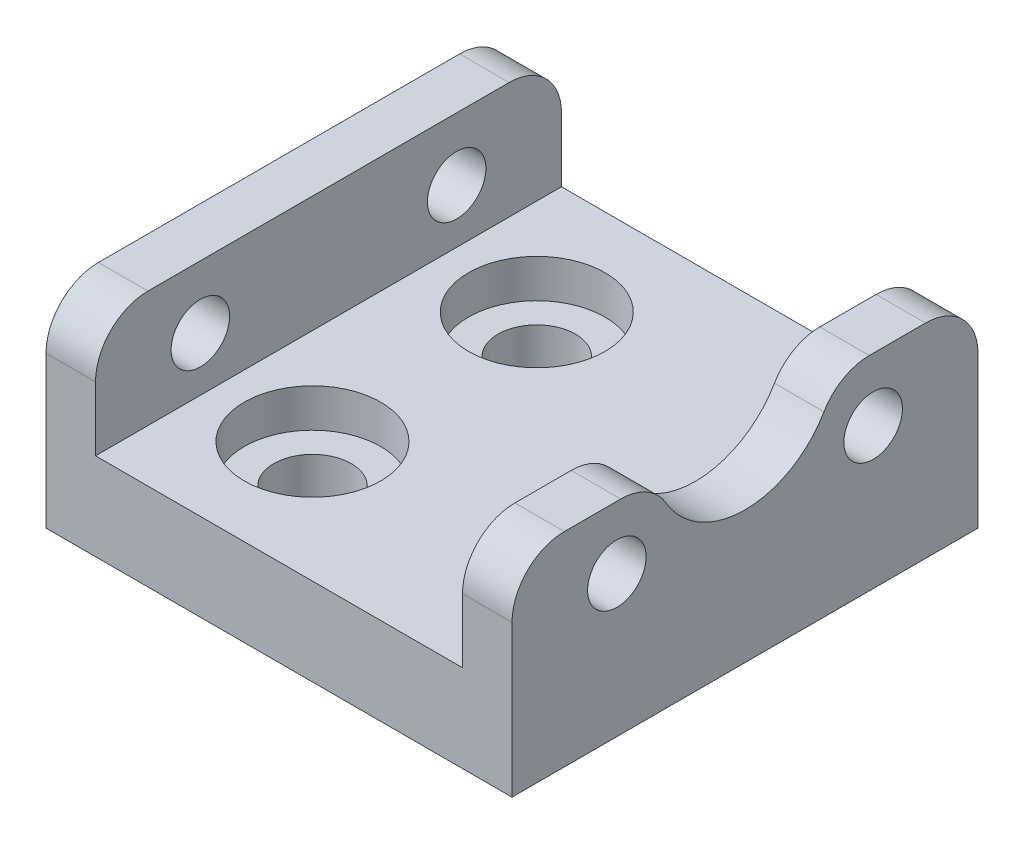
ISO-10303-21;
HEADER;
FILE_DESCRIPTION(('STEP AP214'),'2;1');
FILE_NAME('part.step','',(''),(''),'','','');
FILE_SCHEMA(('AUTOMOTIVE_DESIGN { 1 0 10303 214 1 1 1 1 }'));
ENDSEC;
DATA;
#1=APPLICATION_CONTEXT('core data for automotive mechanical design processes');
#2=APPLICATION_PROTOCOL_DEFINITION('international standard','automotive_design',2000,#1);
#3=PRODUCT_CONTEXT('',#1,'mechanical');
#4=PRODUCT('Part','Part','',(#3));
#5=PRODUCT_RELATED_PRODUCT_CATEGORY('part','',(#4));
#6=PRODUCT_DEFINITION_FORMATION('','',#4);
#7=PRODUCT_DEFINITION_CONTEXT('part definition',#1,'design');
#8=PRODUCT_DEFINITION('design','',#6,#7);
#9=PRODUCT_DEFINITION_SHAPE('','',#8);
#10=(LENGTH_UNIT() NAMED_UNIT(*) SI_UNIT(.MILLI.,.METRE.));
#11=(NAMED_UNIT(*) PLANE_ANGLE_UNIT() SI_UNIT($,.RADIAN.));
#12=(NAMED_UNIT(*) SI_UNIT($,.STERADIAN.) SOLID_ANGLE_UNIT());
#13=UNCERTAINTY_MEASURE_WITH_UNIT(LENGTH_MEASURE(1.E-05),#10,'distance_accuracy_value','');
#14=(GEOMETRIC_REPRESENTATION_CONTEXT(3) GLOBAL_UNCERTAINTY_ASSIGNED_CONTEXT((#13)) GLOBAL_UNIT_ASSIGNED_CONTEXT((#10,
#11,#12)) REPRESENTATION_CONTEXT('',''));
#15=CARTESIAN_POINT('',(0.,0.,0.));
#16=DIRECTION('',(0.,0.,1.));
#17=DIRECTION('',(1.,0.,0.));
#18=AXIS2_PLACEMENT_3D('',#15,#16,#17);
#19=CARTESIAN_POINT('',(0.,17.78,0.));
#20=DIRECTION('',(0.,1.,0.));
#21=DIRECTION('',(0.,0.,1.));
#22=AXIS2_PLACEMENT_3D('',#19,#20,#21);
#23=PLANE('',#22);
#24=DIRECTION('',(0.,0.,-1.));
#25=VECTOR('',#24,1.);
#26=CARTESIAN_POINT('',(40.64,17.78,0.));
#27=LINE('',#26,#25);
#28=CARTESIAN_POINT('',(40.64,17.78,36.068));
#29=VERTEX_POINT('',#28);
#30=CARTESIAN_POINT('',(40.64,17.78,31.1615412763114));
#31=VERTEX_POINT('',#30);
#32=EDGE_CURVE('E159',#29,#31,#27,.T.);
#33=ORIENTED_EDGE('',*,*,#32,.T.);
#34=DIRECTION('',(-1.,0.,0.));
#35=VECTOR('',#34,1.);
#36=CARTESIAN_POINT('',(36.322,17.78,31.1615412763114));
#37=LINE('',#36,#35);
#38=CARTESIAN_POINT('',(36.322,17.78,31.1615412763114));
#39=VERTEX_POINT('',#38);
#40=EDGE_CURVE('E223',#31,#39,#37,.T.);
#41=ORIENTED_EDGE('',*,*,#40,.T.);
#42=DIRECTION('',(0.,0.,1.));
#43=VECTOR('',#42,1.);
#44=CARTESIAN_POINT('',(36.322,17.78,0.));
#45=LINE('',#44,#43);
#46=CARTESIAN_POINT('',(36.322,17.78,36.068));
#47=VERTEX_POINT('',#46);
#48=EDGE_CURVE('E174',#39,#47,#45,.T.);
#49=ORIENTED_EDGE('',*,*,#48,.T.);
#50=DIRECTION('',(1.,0.,0.));
#51=VECTOR('',#50,1.);
#52=CARTESIAN_POINT('',(40.64,17.78,36.068));
#53=LINE('',#52,#51);
#54=EDGE_CURVE('E217',#47,#29,#53,.T.);
#55=ORIENTED_EDGE('',*,*,#54,.T.);
#56=EDGE_LOOP('',(#33,#41,#49,#55));
#57=FACE_BOUND('',#56,.T.);
#58=ADVANCED_FACE('F34',(#57),#23,.T.);
#59=CARTESIAN_POINT('',(0.,7.62,0.));
#60=DIRECTION('',(0.,1.,0.));
#61=DIRECTION('',(0.,0.,1.));
#62=AXIS2_PLACEMENT_3D('',#59,#60,#61);
#63=PLANE('',#62);
#64=CARTESIAN_POINT('',(12.7,7.62,10.541));
#65=DIRECTION('',(0.,1.,0.));
#66=DIRECTION('',(0.,0.,1.));
#67=AXIS2_PLACEMENT_3D('',#64,#65,#66);
#68=CIRCLE('',#67,5.95376);
#69=CARTESIAN_POINT('',(12.7,7.62,16.49476));
#70=VERTEX_POINT('',#69);
#71=EDGE_CURVE('E314',#70,#70,#68,.T.);
#72=ORIENTED_EDGE('',*,*,#71,.F.);
#73=EDGE_LOOP('',(#72));
#74=FACE_BOUND('',#73,.T.);
#75=CARTESIAN_POINT('',(12.7,7.62,30.099));
#76=DIRECTION('',(0.,1.,0.));
#77=DIRECTION('',(0.,0.,1.));
#78=AXIS2_PLACEMENT_3D('',#75,#76,#77);
#79=CIRCLE('',#78,5.95376);
#80=CARTESIAN_POINT('',(12.7,7.62,36.05276));
#81=VERTEX_POINT('',#80);
#82=EDGE_CURVE('E330',#81,#81,#79,.T.);
#83=ORIENTED_EDGE('',*,*,#82,.F.);
#84=EDGE_LOOP('',(#83));
#85=FACE_BOUND('',#84,.T.);
#86=DIRECTION('',(1.,0.,0.));
#87=VECTOR('',#86,1.);
#88=CARTESIAN_POINT('',(0.,7.62,40.64));
#89=LINE('',#88,#87);
#90=CARTESIAN_POINT('',(4.31800000000001,7.62,40.64));
#91=VERTEX_POINT('',#90);
#92=CARTESIAN_POINT('',(36.322,7.62,40.64));
#93=VERTEX_POINT('',#92);
#94=EDGE_CURVE('E169',#91,#93,#89,.T.);
#95=ORIENTED_EDGE('',*,*,#94,.T.);
#96=DIRECTION('',(0.,0.,1.));
#97=VECTOR('',#96,1.);
#98=CARTESIAN_POINT('',(36.322,7.62,0.));
#99=LINE('',#98,#97);
#100=CARTESIAN_POINT('',(36.322,7.62,0.));
#101=VERTEX_POINT('',#100);
#102=EDGE_CURVE('E153',#101,#93,#99,.T.);
#103=ORIENTED_EDGE('',*,*,#102,.F.);
#104=DIRECTION('',(-1.,0.,0.));
#105=VECTOR('',#104,1.);
#106=CARTESIAN_POINT('',(0.,7.62,0.));
#107=LINE('',#106,#105);
#108=CARTESIAN_POINT('',(4.31800000000001,7.62,0.));
#109=VERTEX_POINT('',#108);
#110=EDGE_CURVE('E162',#101,#109,#107,.T.);
#111=ORIENTED_EDGE('',*,*,#110,.T.);
#112=DIRECTION('',(0.,0.,-1.));
#113=VECTOR('',#112,1.);
#114=CARTESIAN_POINT('',(4.31800000000001,7.62,0.));
#115=LINE('',#114,#113);
#116=EDGE_CURVE('E187',#91,#109,#115,.T.);
#117=ORIENTED_EDGE('',*,*,#116,.F.);
#118=EDGE_LOOP('',(#95,#103,#111,#117));
#119=FACE_BOUND('',#118,.T.);
#120=ADVANCED_FACE('F172',(#74,#85,#119),#63,.T.);
#121=CARTESIAN_POINT('',(0.,7.62,0.));
#122=DIRECTION('',(1.,0.,0.));
#123=DIRECTION('',(0.,0.,-1.));
#124=AXIS2_PLACEMENT_3D('',#121,#122,#123);
#125=PLANE('',#124);
#126=CARTESIAN_POINT('',(0.,12.3189999999999,9.14399999999984));
#127=DIRECTION('',(-1.,0.,0.));
#128=DIRECTION('',(0.,0.,1.));
#129=AXIS2_PLACEMENT_3D('',#126,#127,#128);
#130=CIRCLE('',#129,2.5527);
#131=CARTESIAN_POINT('',(0.,12.3189999999999,11.6966999999998));
#132=VERTEX_POINT('',#131);
#133=EDGE_CURVE('E342',#132,#132,#130,.T.);
#134=ORIENTED_EDGE('',*,*,#133,.F.);
#135=EDGE_LOOP('',(#134));
#136=FACE_BOUND('',#135,.T.);
#137=CARTESIAN_POINT('',(0.,12.319,31.496));
#138=DIRECTION('',(-1.,0.,0.));
#139=DIRECTION('',(0.,0.,1.));
#140=AXIS2_PLACEMENT_3D('',#137,#138,#139);
#141=CIRCLE('',#140,2.5527);
#142=CARTESIAN_POINT('',(0.,12.319,34.0487));
#143=VERTEX_POINT('',#142);
#144=EDGE_CURVE('E354',#143,#143,#141,.T.);
#145=ORIENTED_EDGE('',*,*,#144,.F.);
#146=EDGE_LOOP('',(#145));
#147=FACE_BOUND('',#146,.T.);
#148=DIRECTION('',(0.,0.,1.));
#149=VECTOR('',#148,1.);
#150=CARTESIAN_POINT('',(0.,17.78,0.));
#151=LINE('',#150,#149);
#152=CARTESIAN_POINT('',(0.,17.78,4.572));
#153=VERTEX_POINT('',#152);
#154=CARTESIAN_POINT('',(0.,17.78,36.068));
#155=VERTEX_POINT('',#154);
#156=EDGE_CURVE('E188',#153,#155,#151,.T.);
#157=ORIENTED_EDGE('',*,*,#156,.F.);
#158=CARTESIAN_POINT('',(0.,13.208,4.572));
#159=DIRECTION('',(1.,0.,0.));
#160=DIRECTION('',(0.,0.,-1.));
#161=AXIS2_PLACEMENT_3D('',#158,#159,#160);
#162=CIRCLE('',#161,4.572);
#163=CARTESIAN_POINT('',(0.,13.208,0.));
#164=VERTEX_POINT('',#163);
#165=EDGE_CURVE('E266',#153,#164,#162,.F.);
#166=ORIENTED_EDGE('',*,*,#165,.T.);
#167=DIRECTION('',(0.,-1.,0.));
#168=VECTOR('',#167,1.);
#169=CARTESIAN_POINT('',(0.,7.62,0.));
#170=LINE('',#169,#168);
#171=CARTESIAN_POINT('',(0.,0.,0.));
#172=VERTEX_POINT('',#171);
#173=EDGE_CURVE('E168',#164,#172,#170,.T.);
#174=ORIENTED_EDGE('',*,*,#173,.T.);
#175=DIRECTION('',(0.,0.,1.));
#176=VECTOR('',#175,1.);
#177=CARTESIAN_POINT('',(0.,0.,0.));
#178=LINE('',#177,#176);
#179=CARTESIAN_POINT('',(0.,0.,40.64));
#180=VERTEX_POINT('',#179);
#181=EDGE_CURVE('E197',#172,#180,#178,.T.);
#182=ORIENTED_EDGE('',*,*,#181,.T.);
#183=DIRECTION('',(0.,-1.,0.));
#184=VECTOR('',#183,1.);
#185=CARTESIAN_POINT('',(0.,7.62,40.64));
#186=LINE('',#185,#184);
#187=CARTESIAN_POINT('',(0.,13.208,40.64));
#188=VERTEX_POINT('',#187);
#189=EDGE_CURVE('E215',#188,#180,#186,.T.);
#190=ORIENTED_EDGE('',*,*,#189,.F.);
#191=CARTESIAN_POINT('',(0.,13.208,36.068));
#192=DIRECTION('',(1.,0.,0.));
#193=DIRECTION('',(0.,0.,-1.));
#194=AXIS2_PLACEMENT_3D('',#191,#192,#193);
#195=CIRCLE('',#194,4.572);
#196=EDGE_CURVE('E264',#188,#155,#195,.F.);
#197=ORIENTED_EDGE('',*,*,#196,.T.);
#198=EDGE_LOOP('',(#157,#166,#174,#182,#190,#197));
#199=FACE_BOUND('',#198,.T.);
#200=ADVANCED_FACE('F276',(#136,#147,#199),#125,.F.);
#201=CARTESIAN_POINT('',(0.,7.62,40.64));
#202=DIRECTION('',(0.,0.,-1.));
#203=DIRECTION('',(-1.,0.,0.));
#204=AXIS2_PLACEMENT_3D('',#201,#202,#203);
#205=PLANE('',#204);
#206=DIRECTION('',(0.,-1.,0.));
#207=VECTOR('',#206,1.);
#208=CARTESIAN_POINT('',(40.64,7.62,40.64));
#209=LINE('',#208,#207);
#210=CARTESIAN_POINT('',(40.64,13.208,40.64));
#211=VERTEX_POINT('',#210);
#212=CARTESIAN_POINT('',(40.64,0.,40.64));
#213=VERTEX_POINT('',#212);
#214=EDGE_CURVE('E213',#211,#213,#209,.T.);
#215=ORIENTED_EDGE('',*,*,#214,.F.);
#216=DIRECTION('',(1.,0.,0.));
#217=VECTOR('',#216,1.);
#218=CARTESIAN_POINT('',(36.322,13.208,40.64));
#219=LINE('',#218,#217);
#220=CARTESIAN_POINT('',(36.322,13.208,40.64));
#221=VERTEX_POINT('',#220);
#222=EDGE_CURVE('E257',#211,#221,#219,.F.);
#223=ORIENTED_EDGE('',*,*,#222,.T.);
#224=DIRECTION('',(0.,-1.,0.));
#225=VECTOR('',#224,1.);
#226=CARTESIAN_POINT('',(36.322,17.78,40.64));
#227=LINE('',#226,#225);
#228=EDGE_CURVE('E158',#221,#93,#227,.T.);
#229=ORIENTED_EDGE('',*,*,#228,.T.);
#230=ORIENTED_EDGE('',*,*,#94,.F.);
#231=DIRECTION('',(0.,-1.,0.));
#232=VECTOR('',#231,1.);
#233=CARTESIAN_POINT('',(4.31800000000001,17.78,40.64));
#234=LINE('',#233,#232);
#235=CARTESIAN_POINT('',(4.31800000000001,13.208,40.64));
#236=VERTEX_POINT('',#235);
#237=EDGE_CURVE('E195',#236,#91,#234,.T.);
#238=ORIENTED_EDGE('',*,*,#237,.F.);
#239=DIRECTION('',(1.,0.,0.));
#240=VECTOR('',#239,1.);
#241=CARTESIAN_POINT('',(0.,13.208,40.64));
#242=LINE('',#241,#240);
#243=EDGE_CURVE('E255',#236,#188,#242,.F.);
#244=ORIENTED_EDGE('',*,*,#243,.T.);
#245=ORIENTED_EDGE('',*,*,#189,.T.);
#246=DIRECTION('',(1.,0.,0.));
#247=VECTOR('',#246,1.);
#248=CARTESIAN_POINT('',(0.,0.,40.64));
#249=LINE('',#248,#247);
#250=EDGE_CURVE('E202',#180,#213,#249,.T.);
#251=ORIENTED_EDGE('',*,*,#250,.T.);
#252=EDGE_LOOP('',(#215,#223,#229,#230,#238,#244,#245,#251));
#253=FACE_BOUND('',#252,.T.);
#254=ADVANCED_FACE('F271',(#253),#205,.F.);
#255=CARTESIAN_POINT('',(40.64,7.62,0.));
#256=DIRECTION('',(-1.,0.,0.));
#257=DIRECTION('',(0.,0.,1.));
#258=AXIS2_PLACEMENT_3D('',#255,#256,#257);
#259=PLANE('',#258);
#260=CARTESIAN_POINT('',(40.64,12.3189999999999,9.14399999999983));
#261=DIRECTION('',(-1.,0.,0.));
#262=DIRECTION('',(0.,0.,1.));
#263=AXIS2_PLACEMENT_3D('',#260,#261,#262);
#264=CIRCLE('',#263,2.55269999999999);
#265=CARTESIAN_POINT('',(40.64,12.3189999999999,11.6966999999998));
#266=VERTEX_POINT('',#265);
#267=EDGE_CURVE('E345',#266,#266,#264,.T.);
#268=ORIENTED_EDGE('',*,*,#267,.T.);
#269=EDGE_LOOP('',(#268));
#270=FACE_BOUND('',#269,.T.);
#271=CARTESIAN_POINT('',(40.64,12.319,31.496));
#272=DIRECTION('',(-1.,0.,0.));
#273=DIRECTION('',(0.,0.,1.));
#274=AXIS2_PLACEMENT_3D('',#271,#272,#273);
#275=CIRCLE('',#274,2.55269999999999);
#276=CARTESIAN_POINT('',(40.64,12.319,34.0487));
#277=VERTEX_POINT('',#276);
#278=EDGE_CURVE('E220',#277,#277,#275,.T.);
#279=ORIENTED_EDGE('',*,*,#278,.T.);
#280=EDGE_LOOP('',(#279));
#281=FACE_BOUND('',#280,.T.);
#282=CARTESIAN_POINT('',(40.64,19.5045530119415,20.32));
#283=DIRECTION('',(1.,0.,0.));
#284=DIRECTION('',(0.,0.,-1.));
#285=AXIS2_PLACEMENT_3D('',#282,#283,#284);
#286=CIRCLE('',#285,7.96536802834442);
#287=CARTESIAN_POINT('',(40.64,15.5041629829732,27.207958147601));
#288=VERTEX_POINT('',#287);
#289=CARTESIAN_POINT('',(40.64,15.5041629829732,13.432041852399));
#290=VERTEX_POINT('',#289);
#291=EDGE_CURVE('E315',#288,#290,#286,.T.);
#292=ORIENTED_EDGE('',*,*,#291,.F.);
#293=CARTESIAN_POINT('',(40.64,13.208,31.1615412763114));
#294=DIRECTION('',(-1.,0.,0.));
#295=DIRECTION('',(0.,0.,1.));
#296=AXIS2_PLACEMENT_3D('',#293,#294,#295);
#297=CIRCLE('',#296,4.572);
#298=EDGE_CURVE('E243',#288,#31,#297,.F.);
#299=ORIENTED_EDGE('',*,*,#298,.T.);
#300=ORIENTED_EDGE('',*,*,#32,.F.);
#301=CARTESIAN_POINT('',(40.64,13.208,36.068));
#302=DIRECTION('',(-1.,0.,0.));
#303=DIRECTION('',(0.,0.,1.));
#304=AXIS2_PLACEMENT_3D('',#301,#302,#303);
#305=CIRCLE('',#304,4.572);
#306=EDGE_CURVE('E237',#29,#211,#305,.F.);
#307=ORIENTED_EDGE('',*,*,#306,.T.);
#308=ORIENTED_EDGE('',*,*,#214,.T.);
#309=DIRECTION('',(0.,0.,-1.));
#310=VECTOR('',#309,1.);
#311=CARTESIAN_POINT('',(40.64,0.,0.));
#312=LINE('',#311,#310);
#313=CARTESIAN_POINT('',(40.64,0.,0.));
#314=VERTEX_POINT('',#313);
#315=EDGE_CURVE('E205',#213,#314,#312,.T.);
#316=ORIENTED_EDGE('',*,*,#315,.T.);
#317=DIRECTION('',(0.,-1.,0.));
#318=VECTOR('',#317,1.);
#319=CARTESIAN_POINT('',(40.64,7.62,0.));
#320=LINE('',#319,#318);
#321=CARTESIAN_POINT('',(40.64,13.208,0.));
#322=VERTEX_POINT('',#321);
#323=EDGE_CURVE('E211',#322,#314,#320,.T.);
#324=ORIENTED_EDGE('',*,*,#323,.F.);
#325=CARTESIAN_POINT('',(40.64,13.208,4.572));
#326=DIRECTION('',(-1.,0.,0.));
#327=DIRECTION('',(0.,0.,1.));
#328=AXIS2_PLACEMENT_3D('',#325,#326,#327);
#329=CIRCLE('',#328,4.572);
#330=CARTESIAN_POINT('',(40.64,17.78,4.572));
#331=VERTEX_POINT('',#330);
#332=EDGE_CURVE('E239',#322,#331,#329,.F.);
#333=ORIENTED_EDGE('',*,*,#332,.T.);
#334=CARTESIAN_POINT('',(40.64,17.78,9.47845872368865));
#335=VERTEX_POINT('',#334);
#336=EDGE_CURVE('E184',#335,#331,#27,.T.);
#337=ORIENTED_EDGE('',*,*,#336,.F.);
#338=CARTESIAN_POINT('',(40.64,13.208,9.47845872368865));
#339=DIRECTION('',(-1.,0.,0.));
#340=DIRECTION('',(0.,0.,1.));
#341=AXIS2_PLACEMENT_3D('',#338,#339,#340);
#342=CIRCLE('',#341,4.572);
#343=EDGE_CURVE('E241',#335,#290,#342,.F.);
#344=ORIENTED_EDGE('',*,*,#343,.T.);
#345=EDGE_LOOP('',(#292,#299,#300,#307,#308,#316,#324,#333,#337,#344));
#346=FACE_BOUND('',#345,.T.);
#347=ADVANCED_FACE('F368',(#270,#281,#346),#259,.F.);
#348=CARTESIAN_POINT('',(0.,7.62,0.));
#349=DIRECTION('',(0.,0.,1.));
#350=DIRECTION('',(1.,0.,0.));
#351=AXIS2_PLACEMENT_3D('',#348,#349,#350);
#352=PLANE('',#351);
#353=DIRECTION('',(0.,-1.,0.));
#354=VECTOR('',#353,1.);
#355=CARTESIAN_POINT('',(36.322,17.78,0.));
#356=LINE('',#355,#354);
#357=CARTESIAN_POINT('',(36.322,13.208,0.));
#358=VERTEX_POINT('',#357);
#359=EDGE_CURVE('E147',#358,#101,#356,.T.);
#360=ORIENTED_EDGE('',*,*,#359,.F.);
#361=DIRECTION('',(-1.,0.,0.));
#362=VECTOR('',#361,1.);
#363=CARTESIAN_POINT('',(40.64,13.208,0.));
#364=LINE('',#363,#362);
#365=EDGE_CURVE('E253',#358,#322,#364,.F.);
#366=ORIENTED_EDGE('',*,*,#365,.T.);
#367=ORIENTED_EDGE('',*,*,#323,.T.);
#368=DIRECTION('',(-1.,0.,0.));
#369=VECTOR('',#368,1.);
#370=CARTESIAN_POINT('',(0.,0.,0.));
#371=LINE('',#370,#369);
#372=EDGE_CURVE('E198',#314,#172,#371,.T.);
#373=ORIENTED_EDGE('',*,*,#372,.T.);
#374=ORIENTED_EDGE('',*,*,#173,.F.);
#375=DIRECTION('',(-1.,0.,0.));
#376=VECTOR('',#375,1.);
#377=CARTESIAN_POINT('',(4.31800000000001,13.208,0.));
#378=LINE('',#377,#376);
#379=CARTESIAN_POINT('',(4.31800000000001,13.208,0.));
#380=VERTEX_POINT('',#379);
#381=EDGE_CURVE('E251',#164,#380,#378,.F.);
#382=ORIENTED_EDGE('',*,*,#381,.T.);
#383=DIRECTION('',(0.,-1.,0.));
#384=VECTOR('',#383,1.);
#385=CARTESIAN_POINT('',(4.31800000000001,17.78,0.));
#386=LINE('',#385,#384);
#387=EDGE_CURVE('E164',#380,#109,#386,.T.);
#388=ORIENTED_EDGE('',*,*,#387,.T.);
#389=ORIENTED_EDGE('',*,*,#110,.F.);
#390=EDGE_LOOP('',(#360,#366,#367,#373,#374,#382,#388,#389));
#391=FACE_BOUND('',#390,.T.);
#392=ADVANCED_FACE('F163',(#391),#352,.F.);
#393=CARTESIAN_POINT('',(0.,0.,0.));
#394=DIRECTION('',(0.,1.,0.));
#395=DIRECTION('',(0.,0.,1.));
#396=AXIS2_PLACEMENT_3D('',#393,#394,#395);
#397=PLANE('',#396);
#398=CARTESIAN_POINT('',(12.7,0.,10.541));
#399=DIRECTION('',(0.,1.,0.));
#400=DIRECTION('',(0.,0.,1.));
#401=AXIS2_PLACEMENT_3D('',#398,#399,#400);
#402=CIRCLE('',#401,3.3782);
#403=CARTESIAN_POINT('',(12.7,0.,13.9192));
#404=VERTEX_POINT('',#403);
#405=EDGE_CURVE('E327',#404,#404,#402,.T.);
#406=ORIENTED_EDGE('',*,*,#405,.T.);
#407=EDGE_LOOP('',(#406));
#408=FACE_BOUND('',#407,.T.);
#409=CARTESIAN_POINT('',(12.7,0.,30.099));
#410=DIRECTION('',(0.,1.,0.));
#411=DIRECTION('',(0.,0.,1.));
#412=AXIS2_PLACEMENT_3D('',#409,#410,#411);
#413=CIRCLE('',#412,3.3782);
#414=CARTESIAN_POINT('',(12.7,0.,33.4772));
#415=VERTEX_POINT('',#414);
#416=EDGE_CURVE('E339',#415,#415,#413,.T.);
#417=ORIENTED_EDGE('',*,*,#416,.T.);
#418=EDGE_LOOP('',(#417));
#419=FACE_BOUND('',#418,.T.);
#420=ORIENTED_EDGE('',*,*,#181,.F.);
#421=ORIENTED_EDGE('',*,*,#372,.F.);
#422=ORIENTED_EDGE('',*,*,#315,.F.);
#423=ORIENTED_EDGE('',*,*,#250,.F.);
#424=EDGE_LOOP('',(#420,#421,#422,#423));
#425=FACE_BOUND('',#424,.T.);
#426=ADVANCED_FACE('F290',(#408,#419,#425),#397,.F.);
#427=CARTESIAN_POINT('',(4.31800000000001,17.78,0.));
#428=DIRECTION('',(-1.,0.,0.));
#429=DIRECTION('',(0.,0.,1.));
#430=AXIS2_PLACEMENT_3D('',#427,#428,#429);
#431=PLANE('',#430);
#432=CARTESIAN_POINT('',(4.31800000000001,12.3189999999999,9.14399999999984));
#433=DIRECTION('',(-1.,0.,0.));
#434=DIRECTION('',(0.,0.,1.));
#435=AXIS2_PLACEMENT_3D('',#432,#433,#434);
#436=CIRCLE('',#435,2.5527);
#437=CARTESIAN_POINT('',(4.31800000000001,12.3189999999999,11.6966999999998));
#438=VERTEX_POINT('',#437);
#439=EDGE_CURVE('E348',#438,#438,#436,.T.);
#440=ORIENTED_EDGE('',*,*,#439,.T.);
#441=EDGE_LOOP('',(#440));
#442=FACE_BOUND('',#441,.T.);
#443=CARTESIAN_POINT('',(4.31800000000001,12.319,31.496));
#444=DIRECTION('',(-1.,0.,0.));
#445=DIRECTION('',(0.,0.,1.));
#446=AXIS2_PLACEMENT_3D('',#443,#444,#445);
#447=CIRCLE('',#446,2.5527);
#448=CARTESIAN_POINT('',(4.31800000000001,12.319,34.0487));
#449=VERTEX_POINT('',#448);
#450=EDGE_CURVE('E181',#449,#449,#447,.T.);
#451=ORIENTED_EDGE('',*,*,#450,.T.);
#452=EDGE_LOOP('',(#451));
#453=FACE_BOUND('',#452,.T.);
#454=ORIENTED_EDGE('',*,*,#387,.F.);
#455=CARTESIAN_POINT('',(4.31800000000001,13.208,4.572));
#456=DIRECTION('',(-1.,0.,0.));
#457=DIRECTION('',(0.,0.,1.));
#458=AXIS2_PLACEMENT_3D('',#455,#456,#457);
#459=CIRCLE('',#458,4.572);
#460=CARTESIAN_POINT('',(4.31800000000001,17.78,4.572));
#461=VERTEX_POINT('',#460);
#462=EDGE_CURVE('E11',#380,#461,#459,.F.);
#463=ORIENTED_EDGE('',*,*,#462,.T.);
#464=DIRECTION('',(0.,0.,-1.));
#465=VECTOR('',#464,1.);
#466=CARTESIAN_POINT('',(4.31800000000001,17.78,0.));
#467=LINE('',#466,#465);
#468=CARTESIAN_POINT('',(4.31800000000001,17.78,36.068));
#469=VERTEX_POINT('',#468);
#470=EDGE_CURVE('E191',#469,#461,#467,.T.);
#471=ORIENTED_EDGE('',*,*,#470,.F.);
#472=CARTESIAN_POINT('',(4.31800000000001,13.208,36.068));
#473=DIRECTION('',(-1.,0.,0.));
#474=DIRECTION('',(0.,0.,1.));
#475=AXIS2_PLACEMENT_3D('',#472,#473,#474);
#476=CIRCLE('',#475,4.572);
#477=EDGE_CURVE('E42',#469,#236,#476,.F.);
#478=ORIENTED_EDGE('',*,*,#477,.T.);
#479=ORIENTED_EDGE('',*,*,#237,.T.);
#480=ORIENTED_EDGE('',*,*,#116,.T.);
#481=EDGE_LOOP('',(#454,#463,#471,#478,#479,#480));
#482=FACE_BOUND('',#481,.T.);
#483=ADVANCED_FACE('F268',(#442,#453,#482),#431,.F.);
#484=CARTESIAN_POINT('',(0.,17.78,0.));
#485=DIRECTION('',(0.,1.,0.));
#486=DIRECTION('',(0.,0.,1.));
#487=AXIS2_PLACEMENT_3D('',#484,#485,#486);
#488=PLANE('',#487);
#489=ORIENTED_EDGE('',*,*,#470,.T.);
#490=DIRECTION('',(-1.,0.,0.));
#491=VECTOR('',#490,1.);
#492=CARTESIAN_POINT('',(0.,17.78,4.572));
#493=LINE('',#492,#491);
#494=EDGE_CURVE('E261',#461,#153,#493,.T.);
#495=ORIENTED_EDGE('',*,*,#494,.T.);
#496=ORIENTED_EDGE('',*,*,#156,.T.);
#497=DIRECTION('',(1.,0.,0.));
#498=VECTOR('',#497,1.);
#499=CARTESIAN_POINT('',(4.31800000000001,17.78,36.068));
#500=LINE('',#499,#498);
#501=EDGE_CURVE('E259',#155,#469,#500,.T.);
#502=ORIENTED_EDGE('',*,*,#501,.T.);
#503=EDGE_LOOP('',(#489,#495,#496,#502));
#504=FACE_BOUND('',#503,.T.);
#505=ADVANCED_FACE('F278',(#504),#488,.T.);
#506=CARTESIAN_POINT('',(36.322,17.78,0.));
#507=DIRECTION('',(1.,0.,0.));
#508=DIRECTION('',(0.,0.,-1.));
#509=AXIS2_PLACEMENT_3D('',#506,#507,#508);
#510=PLANE('',#509);
#511=CARTESIAN_POINT('',(36.322,12.3189999999999,9.14399999999983));
#512=DIRECTION('',(1.,0.,0.));
#513=DIRECTION('',(0.,0.,-1.));
#514=AXIS2_PLACEMENT_3D('',#511,#512,#513);
#515=CIRCLE('',#514,2.5527);
#516=CARTESIAN_POINT('',(36.322,12.3189999999999,6.59129999999984));
#517=VERTEX_POINT('',#516);
#518=EDGE_CURVE('E351',#517,#517,#515,.T.);
#519=ORIENTED_EDGE('',*,*,#518,.T.);
#520=EDGE_LOOP('',(#519));
#521=FACE_BOUND('',#520,.T.);
#522=CARTESIAN_POINT('',(36.322,12.319,31.496));
#523=DIRECTION('',(1.,0.,0.));
#524=DIRECTION('',(0.,0.,-1.));
#525=AXIS2_PLACEMENT_3D('',#522,#523,#524);
#526=CIRCLE('',#525,2.5527);
#527=CARTESIAN_POINT('',(36.322,12.319,28.9433));
#528=VERTEX_POINT('',#527);
#529=EDGE_CURVE('E175',#528,#528,#526,.T.);
#530=ORIENTED_EDGE('',*,*,#529,.T.);
#531=EDGE_LOOP('',(#530));
#532=FACE_BOUND('',#531,.T.);
#533=ORIENTED_EDGE('',*,*,#48,.F.);
#534=CARTESIAN_POINT('',(36.322,13.208,31.1615412763114));
#535=DIRECTION('',(1.,0.,0.));
#536=DIRECTION('',(0.,0.,-1.));
#537=AXIS2_PLACEMENT_3D('',#534,#535,#536);
#538=CIRCLE('',#537,4.572);
#539=CARTESIAN_POINT('',(36.322,15.5041629829732,27.207958147601));
#540=VERTEX_POINT('',#539);
#541=EDGE_CURVE('E231',#39,#540,#538,.F.);
#542=ORIENTED_EDGE('',*,*,#541,.T.);
#543=CARTESIAN_POINT('',(36.322,19.5045530119415,20.32));
#544=DIRECTION('',(1.,0.,0.));
#545=DIRECTION('',(0.,0.,-1.));
#546=AXIS2_PLACEMENT_3D('',#543,#544,#545);
#547=CIRCLE('',#546,7.96536802834442);
#548=CARTESIAN_POINT('',(36.322,15.5041629829732,13.432041852399));
#549=VERTEX_POINT('',#548);
#550=EDGE_CURVE('E307',#549,#540,#547,.F.);
#551=ORIENTED_EDGE('',*,*,#550,.F.);
#552=CARTESIAN_POINT('',(36.322,13.208,9.47845872368865));
#553=DIRECTION('',(1.,0.,0.));
#554=DIRECTION('',(0.,0.,-1.));
#555=AXIS2_PLACEMENT_3D('',#552,#553,#554);
#556=CIRCLE('',#555,4.572);
#557=CARTESIAN_POINT('',(36.322,17.78,9.47845872368865));
#558=VERTEX_POINT('',#557);
#559=EDGE_CURVE('E229',#549,#558,#556,.F.);
#560=ORIENTED_EDGE('',*,*,#559,.T.);
#561=CARTESIAN_POINT('',(36.322,17.78,4.572));
#562=VERTEX_POINT('',#561);
#563=EDGE_CURVE('E178',#562,#558,#45,.T.);
#564=ORIENTED_EDGE('',*,*,#563,.F.);
#565=CARTESIAN_POINT('',(36.322,13.208,4.572));
#566=DIRECTION('',(1.,0.,0.));
#567=DIRECTION('',(0.,0.,-1.));
#568=AXIS2_PLACEMENT_3D('',#565,#566,#567);
#569=CIRCLE('',#568,4.572);
#570=EDGE_CURVE('E155',#562,#358,#569,.F.);
#571=ORIENTED_EDGE('',*,*,#570,.T.);
#572=ORIENTED_EDGE('',*,*,#359,.T.);
#573=ORIENTED_EDGE('',*,*,#102,.T.);
#574=ORIENTED_EDGE('',*,*,#228,.F.);
#575=CARTESIAN_POINT('',(36.322,13.208,36.068));
#576=DIRECTION('',(1.,0.,0.));
#577=DIRECTION('',(0.,0.,-1.));
#578=AXIS2_PLACEMENT_3D('',#575,#576,#577);
#579=CIRCLE('',#578,4.572);
#580=EDGE_CURVE('E226',#221,#47,#579,.F.);
#581=ORIENTED_EDGE('',*,*,#580,.T.);
#582=EDGE_LOOP('',(#533,#542,#551,#560,#564,#571,#572,#573,#574,#581));
#583=FACE_BOUND('',#582,.T.);
#584=ADVANCED_FACE('F150',(#521,#532,#583),#510,.F.);
#585=ORIENTED_EDGE('',*,*,#563,.T.);
#586=DIRECTION('',(-1.,0.,0.));
#587=VECTOR('',#586,1.);
#588=CARTESIAN_POINT('',(40.64,17.78,9.47845872368865));
#589=LINE('',#588,#587);
#590=EDGE_CURVE('E248',#558,#335,#589,.F.);
#591=ORIENTED_EDGE('',*,*,#590,.T.);
#592=ORIENTED_EDGE('',*,*,#336,.T.);
#593=DIRECTION('',(-1.,0.,0.));
#594=VECTOR('',#593,1.);
#595=CARTESIAN_POINT('',(36.322,17.78,4.572));
#596=LINE('',#595,#594);
#597=EDGE_CURVE('E245',#331,#562,#596,.T.);
#598=ORIENTED_EDGE('',*,*,#597,.T.);
#599=EDGE_LOOP('',(#585,#591,#592,#598));
#600=FACE_BOUND('',#599,.T.);
#601=ADVANCED_FACE('F364',(#600),#23,.T.);
#602=CARTESIAN_POINT('',(0.,12.319,31.496));
#603=DIRECTION('',(-1.,0.,0.));
#604=DIRECTION('',(0.,0.,1.));
#605=AXIS2_PLACEMENT_3D('',#602,#603,#604);
#606=CYLINDRICAL_SURFACE('',#605,2.5527);
#607=ORIENTED_EDGE('',*,*,#144,.T.);
#608=EDGE_LOOP('',(#607));
#609=FACE_BOUND('',#608,.T.);
#610=ORIENTED_EDGE('',*,*,#450,.F.);
#611=EDGE_LOOP('',(#610));
#612=FACE_BOUND('',#611,.T.);
#613=ADVANCED_FACE('F389',(#609,#612),#606,.F.);
#614=ORIENTED_EDGE('',*,*,#278,.F.);
#615=EDGE_LOOP('',(#614));
#616=FACE_BOUND('',#615,.T.);
#617=ORIENTED_EDGE('',*,*,#529,.F.);
#618=EDGE_LOOP('',(#617));
#619=FACE_BOUND('',#618,.T.);
#620=ADVANCED_FACE('F394',(#616,#619),#606,.F.);
#621=CARTESIAN_POINT('',(0.,12.3189999999999,9.14399999999984));
#622=DIRECTION('',(-1.,0.,0.));
#623=DIRECTION('',(0.,0.,1.));
#624=AXIS2_PLACEMENT_3D('',#621,#622,#623);
#625=CYLINDRICAL_SURFACE('',#624,2.5527);
#626=ORIENTED_EDGE('',*,*,#267,.F.);
#627=EDGE_LOOP('',(#626));
#628=FACE_BOUND('',#627,.T.);
#629=ORIENTED_EDGE('',*,*,#518,.F.);
#630=EDGE_LOOP('',(#629));
#631=FACE_BOUND('',#630,.T.);
#632=ADVANCED_FACE('F442',(#628,#631),#625,.F.);
#633=ORIENTED_EDGE('',*,*,#133,.T.);
#634=EDGE_LOOP('',(#633));
#635=FACE_BOUND('',#634,.T.);
#636=ORIENTED_EDGE('',*,*,#439,.F.);
#637=EDGE_LOOP('',(#636));
#638=FACE_BOUND('',#637,.T.);
#639=ADVANCED_FACE('F418',(#635,#638),#625,.F.);
#640=CARTESIAN_POINT('',(12.7,7.62,30.099));
#641=DIRECTION('',(0.,1.,0.));
#642=DIRECTION('',(0.,0.,1.));
#643=AXIS2_PLACEMENT_3D('',#640,#641,#642);
#644=CYLINDRICAL_SURFACE('',#643,3.3782);
#645=ORIENTED_EDGE('',*,*,#416,.F.);
#646=EDGE_LOOP('',(#645));
#647=FACE_BOUND('',#646,.T.);
#648=CARTESIAN_POINT('',(12.7,4.2672,30.099));
#649=DIRECTION('',(0.,1.,0.));
#650=DIRECTION('',(0.,0.,1.));
#651=AXIS2_PLACEMENT_3D('',#648,#649,#650);
#652=CIRCLE('',#651,3.3782);
#653=CARTESIAN_POINT('',(12.7,4.2672,33.4772));
#654=VERTEX_POINT('',#653);
#655=EDGE_CURVE('E336',#654,#654,#652,.T.);
#656=ORIENTED_EDGE('',*,*,#655,.T.);
#657=EDGE_LOOP('',(#656));
#658=FACE_BOUND('',#657,.T.);
#659=ADVANCED_FACE('F414',(#647,#658),#644,.F.);
#660=CARTESIAN_POINT('',(16.0782,4.2672,30.099));
#661=DIRECTION('',(0.,-1.,0.));
#662=DIRECTION('',(0.,0.,-1.));
#663=AXIS2_PLACEMENT_3D('',#660,#661,#662);
#664=PLANE('',#663);
#665=ORIENTED_EDGE('',*,*,#655,.F.);
#666=EDGE_LOOP('',(#665));
#667=FACE_BOUND('',#666,.T.);
#668=CARTESIAN_POINT('',(12.7,4.2672,30.099));
#669=DIRECTION('',(0.,1.,0.));
#670=DIRECTION('',(0.,0.,1.));
#671=AXIS2_PLACEMENT_3D('',#668,#669,#670);
#672=CIRCLE('',#671,5.95376);
#673=CARTESIAN_POINT('',(12.7,4.2672,36.05276));
#674=VERTEX_POINT('',#673);
#675=EDGE_CURVE('E333',#674,#674,#672,.T.);
#676=ORIENTED_EDGE('',*,*,#675,.T.);
#677=EDGE_LOOP('',(#676));
#678=FACE_BOUND('',#677,.T.);
#679=ADVANCED_FACE('F417',(#667,#678),#664,.F.);
#680=CARTESIAN_POINT('',(12.7,7.62,30.099));
#681=DIRECTION('',(0.,1.,0.));
#682=DIRECTION('',(0.,0.,1.));
#683=AXIS2_PLACEMENT_3D('',#680,#681,#682);
#684=CYLINDRICAL_SURFACE('',#683,5.95376);
#685=ORIENTED_EDGE('',*,*,#675,.F.);
#686=EDGE_LOOP('',(#685));
#687=FACE_BOUND('',#686,.T.);
#688=ORIENTED_EDGE('',*,*,#82,.T.);
#689=EDGE_LOOP('',(#688));
#690=FACE_BOUND('',#689,.T.);
#691=ADVANCED_FACE('F424',(#687,#690),#684,.F.);
#692=CARTESIAN_POINT('',(12.7,7.62,10.541));
#693=DIRECTION('',(0.,1.,0.));
#694=DIRECTION('',(0.,0.,1.));
#695=AXIS2_PLACEMENT_3D('',#692,#693,#694);
#696=CYLINDRICAL_SURFACE('',#695,3.3782);
#697=ORIENTED_EDGE('',*,*,#405,.F.);
#698=EDGE_LOOP('',(#697));
#699=FACE_BOUND('',#698,.T.);
#700=CARTESIAN_POINT('',(12.7,4.2672,10.541));
#701=DIRECTION('',(0.,1.,0.));
#702=DIRECTION('',(0.,0.,1.));
#703=AXIS2_PLACEMENT_3D('',#700,#701,#702);
#704=CIRCLE('',#703,3.3782);
#705=CARTESIAN_POINT('',(12.7,4.2672,13.9192));
#706=VERTEX_POINT('',#705);
#707=EDGE_CURVE('E324',#706,#706,#704,.T.);
#708=ORIENTED_EDGE('',*,*,#707,.T.);
#709=EDGE_LOOP('',(#708));
#710=FACE_BOUND('',#709,.T.);
#711=ADVANCED_FACE('F430',(#699,#710),#696,.F.);
#712=CARTESIAN_POINT('',(16.0782,4.2672,10.541));
#713=DIRECTION('',(0.,-1.,0.));
#714=DIRECTION('',(0.,0.,-1.));
#715=AXIS2_PLACEMENT_3D('',#712,#713,#714);
#716=PLANE('',#715);
#717=ORIENTED_EDGE('',*,*,#707,.F.);
#718=EDGE_LOOP('',(#717));
#719=FACE_BOUND('',#718,.T.);
#720=CARTESIAN_POINT('',(12.7,4.2672,10.541));
#721=DIRECTION('',(0.,1.,0.));
#722=DIRECTION('',(0.,0.,1.));
#723=AXIS2_PLACEMENT_3D('',#720,#721,#722);
#724=CIRCLE('',#723,5.95376);
#725=CARTESIAN_POINT('',(12.7,4.2672,16.49476));
#726=VERTEX_POINT('',#725);
#727=EDGE_CURVE('E318',#726,#726,#724,.T.);
#728=ORIENTED_EDGE('',*,*,#727,.T.);
#729=EDGE_LOOP('',(#728));
#730=FACE_BOUND('',#729,.T.);
#731=ADVANCED_FACE('F437',(#719,#730),#716,.F.);
#732=CARTESIAN_POINT('',(12.7,7.62,10.541));
#733=DIRECTION('',(0.,1.,0.));
#734=DIRECTION('',(0.,0.,1.));
#735=AXIS2_PLACEMENT_3D('',#732,#733,#734);
#736=CYLINDRICAL_SURFACE('',#735,5.95376);
#737=ORIENTED_EDGE('',*,*,#727,.F.);
#738=EDGE_LOOP('',(#737));
#739=FACE_BOUND('',#738,.T.);
#740=ORIENTED_EDGE('',*,*,#71,.T.);
#741=EDGE_LOOP('',(#740));
#742=FACE_BOUND('',#741,.T.);
#743=ADVANCED_FACE('F492',(#739,#742),#736,.F.);
#744=CARTESIAN_POINT('',(-0.00100000000000794,19.5045530119415,20.32));
#745=DIRECTION('',(1.,0.,0.));
#746=DIRECTION('',(0.,0.,-1.));
#747=AXIS2_PLACEMENT_3D('',#744,#745,#746);
#748=CYLINDRICAL_SURFACE('',#747,7.96536802834442);
#749=ORIENTED_EDGE('',*,*,#550,.T.);
#750=DIRECTION('',(1.,0.,0.));
#751=VECTOR('',#750,1.);
#752=CARTESIAN_POINT('',(-0.00100000000000676,15.5041629829732,27.207958147601));
#753=LINE('',#752,#751);
#754=EDGE_CURVE('E235',#540,#288,#753,.T.);
#755=ORIENTED_EDGE('',*,*,#754,.T.);
#756=ORIENTED_EDGE('',*,*,#291,.T.);
#757=DIRECTION('',(1.,0.,0.));
#758=VECTOR('',#757,1.);
#759=CARTESIAN_POINT('',(-0.00100000000000912,15.5041629829732,13.432041852399));
#760=LINE('',#759,#758);
#761=EDGE_CURVE('E233',#290,#549,#760,.F.);
#762=ORIENTED_EDGE('',*,*,#761,.T.);
#763=EDGE_LOOP('',(#749,#755,#756,#762));
#764=FACE_BOUND('',#763,.T.);
#765=ADVANCED_FACE('F310',(#764),#748,.F.);
#766=CARTESIAN_POINT('',(-0.00100000000000609,13.208,31.1615412763114));
#767=DIRECTION('',(1.,0.,0.));
#768=DIRECTION('',(0.,0.,-1.));
#769=AXIS2_PLACEMENT_3D('',#766,#767,#768);
#770=CYLINDRICAL_SURFACE('',#769,4.572);
#771=ORIENTED_EDGE('',*,*,#298,.F.);
#772=ORIENTED_EDGE('',*,*,#754,.F.);
#773=ORIENTED_EDGE('',*,*,#541,.F.);
#774=ORIENTED_EDGE('',*,*,#40,.F.);
#775=EDGE_LOOP('',(#771,#772,#773,#774));
#776=FACE_BOUND('',#775,.T.);
#777=ADVANCED_FACE('F303',(#776),#770,.T.);
#778=CARTESIAN_POINT('',(-0.00100000000000979,13.208,9.47845872368866));
#779=DIRECTION('',(1.,0.,0.));
#780=DIRECTION('',(0.,0.,-1.));
#781=AXIS2_PLACEMENT_3D('',#778,#779,#780);
#782=CYLINDRICAL_SURFACE('',#781,4.572);
#783=ORIENTED_EDGE('',*,*,#559,.F.);
#784=ORIENTED_EDGE('',*,*,#761,.F.);
#785=ORIENTED_EDGE('',*,*,#343,.F.);
#786=ORIENTED_EDGE('',*,*,#590,.F.);
#787=EDGE_LOOP('',(#783,#784,#785,#786));
#788=FACE_BOUND('',#787,.T.);
#789=ADVANCED_FACE('F573',(#788),#782,.T.);
#790=CARTESIAN_POINT('',(0.,13.208,4.572));
#791=DIRECTION('',(1.,0.,0.));
#792=DIRECTION('',(0.,0.,-1.));
#793=AXIS2_PLACEMENT_3D('',#790,#791,#792);
#794=CYLINDRICAL_SURFACE('',#793,4.572);
#795=ORIENTED_EDGE('',*,*,#332,.F.);
#796=ORIENTED_EDGE('',*,*,#365,.F.);
#797=ORIENTED_EDGE('',*,*,#570,.F.);
#798=ORIENTED_EDGE('',*,*,#597,.F.);
#799=EDGE_LOOP('',(#795,#796,#797,#798));
#800=FACE_BOUND('',#799,.T.);
#801=ADVANCED_FACE('F367',(#800),#794,.T.);
#802=CARTESIAN_POINT('',(0.,13.208,36.068));
#803=DIRECTION('',(-1.,0.,0.));
#804=DIRECTION('',(0.,0.,1.));
#805=AXIS2_PLACEMENT_3D('',#802,#803,#804);
#806=CYLINDRICAL_SURFACE('',#805,4.572);
#807=ORIENTED_EDGE('',*,*,#580,.F.);
#808=ORIENTED_EDGE('',*,*,#222,.F.);
#809=ORIENTED_EDGE('',*,*,#306,.F.);
#810=ORIENTED_EDGE('',*,*,#54,.F.);
#811=EDGE_LOOP('',(#807,#808,#809,#810));
#812=FACE_BOUND('',#811,.T.);
#813=ADVANCED_FACE('F295',(#812),#806,.T.);
#814=CARTESIAN_POINT('',(0.,13.208,4.572));
#815=DIRECTION('',(1.,0.,0.));
#816=DIRECTION('',(0.,0.,-1.));
#817=AXIS2_PLACEMENT_3D('',#814,#815,#816);
#818=CYLINDRICAL_SURFACE('',#817,4.572);
#819=ORIENTED_EDGE('',*,*,#462,.F.);
#820=ORIENTED_EDGE('',*,*,#381,.F.);
#821=ORIENTED_EDGE('',*,*,#165,.F.);
#822=ORIENTED_EDGE('',*,*,#494,.F.);
#823=EDGE_LOOP('',(#819,#820,#821,#822));
#824=FACE_BOUND('',#823,.T.);
#825=ADVANCED_FACE('F281',(#824),#818,.T.);
#826=CARTESIAN_POINT('',(0.,13.208,36.068));
#827=DIRECTION('',(-1.,0.,0.));
#828=DIRECTION('',(0.,0.,1.));
#829=AXIS2_PLACEMENT_3D('',#826,#827,#828);
#830=CYLINDRICAL_SURFACE('',#829,4.572);
#831=ORIENTED_EDGE('',*,*,#196,.F.);
#832=ORIENTED_EDGE('',*,*,#243,.F.);
#833=ORIENTED_EDGE('',*,*,#477,.F.);
#834=ORIENTED_EDGE('',*,*,#501,.F.);
#835=EDGE_LOOP('',(#831,#832,#833,#834));
#836=FACE_BOUND('',#835,.T.);
#837=ADVANCED_FACE('F36',(#836),#830,.T.);
#838=CLOSED_SHELL('',(#58,#120,#200,#254,#347,#392,#426,#483,#505,#584,#601,#613,#620,#632,#639,
#659,#679,#691,#711,#731,#743,#765,#777,#789,#801,#813,#825,#837));
#839=MANIFOLD_SOLID_BREP('B2',#838);
#840=ADVANCED_BREP_SHAPE_REPRESENTATION('',(#18,#839),#14);
#841=SHAPE_DEFINITION_REPRESENTATION(#9,#840);
ENDSEC;
END-ISO-10303-21;
